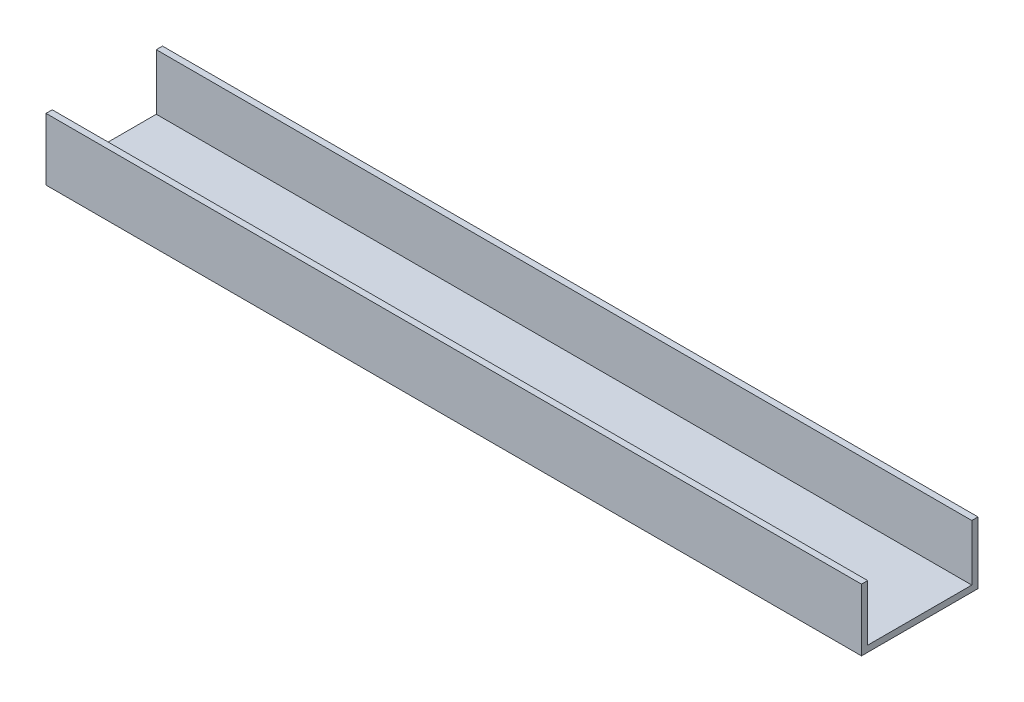
ISO-10303-21;
HEADER;
FILE_DESCRIPTION(('STEP AP214'),'2;1');
FILE_NAME('part.step','',(''),(''),'','','');
FILE_SCHEMA(('AUTOMOTIVE_DESIGN { 1 0 10303 214 1 1 1 1 }'));
ENDSEC;
DATA;
#1=APPLICATION_CONTEXT('core data for automotive mechanical design processes');
#2=APPLICATION_PROTOCOL_DEFINITION('international standard','automotive_design',2000,#1);
#3=PRODUCT_CONTEXT('',#1,'mechanical');
#4=PRODUCT('Part','Part','',(#3));
#5=PRODUCT_RELATED_PRODUCT_CATEGORY('part','',(#4));
#6=PRODUCT_DEFINITION_FORMATION('','',#4);
#7=PRODUCT_DEFINITION_CONTEXT('part definition',#1,'design');
#8=PRODUCT_DEFINITION('design','',#6,#7);
#9=PRODUCT_DEFINITION_SHAPE('','',#8);
#10=(LENGTH_UNIT() NAMED_UNIT(*) SI_UNIT(.MILLI.,.METRE.));
#11=(NAMED_UNIT(*) PLANE_ANGLE_UNIT() SI_UNIT($,.RADIAN.));
#12=(NAMED_UNIT(*) SI_UNIT($,.STERADIAN.) SOLID_ANGLE_UNIT());
#13=UNCERTAINTY_MEASURE_WITH_UNIT(LENGTH_MEASURE(1.E-05),#10,'distance_accuracy_value','');
#14=(GEOMETRIC_REPRESENTATION_CONTEXT(3) GLOBAL_UNCERTAINTY_ASSIGNED_CONTEXT((#13)) GLOBAL_UNIT_ASSIGNED_CONTEXT((#10,
#11,#12)) REPRESENTATION_CONTEXT('',''));
#15=CARTESIAN_POINT('',(0.,0.,0.));
#16=DIRECTION('',(0.,0.,1.));
#17=DIRECTION('',(1.,0.,0.));
#18=AXIS2_PLACEMENT_3D('',#15,#16,#17);
#19=CARTESIAN_POINT('',(0.,4.,0.));
#20=DIRECTION('',(0.,-1.,0.));
#21=DIRECTION('',(0.,0.,-1.));
#22=AXIS2_PLACEMENT_3D('',#19,#20,#21);
#23=PLANE('',#22);
#24=DIRECTION('',(-1.,0.,0.));
#25=VECTOR('',#24,1.);
#26=CARTESIAN_POINT('',(525.,4.,-4.));
#27=LINE('',#26,#25);
#28=CARTESIAN_POINT('',(525.,4.,-4.));
#29=VERTEX_POINT('',#28);
#30=CARTESIAN_POINT('',(0.,4.,-4.));
#31=VERTEX_POINT('',#30);
#32=EDGE_CURVE('E121',#29,#31,#27,.T.);
#33=ORIENTED_EDGE('',*,*,#32,.F.);
#34=DIRECTION('',(0.,0.,-1.));
#35=VECTOR('',#34,1.);
#36=CARTESIAN_POINT('',(525.,4.,0.));
#37=LINE('',#36,#35);
#38=CARTESIAN_POINT('',(525.,4.,-71.));
#39=VERTEX_POINT('',#38);
#40=EDGE_CURVE('E110',#29,#39,#37,.T.);
#41=ORIENTED_EDGE('',*,*,#40,.T.);
#42=DIRECTION('',(1.,0.,0.));
#43=VECTOR('',#42,1.);
#44=CARTESIAN_POINT('',(0.,4.,-71.));
#45=LINE('',#44,#43);
#46=CARTESIAN_POINT('',(0.,4.,-71.));
#47=VERTEX_POINT('',#46);
#48=EDGE_CURVE('E66',#47,#39,#45,.T.);
#49=ORIENTED_EDGE('',*,*,#48,.F.);
#50=DIRECTION('',(0.,0.,1.));
#51=VECTOR('',#50,1.);
#52=CARTESIAN_POINT('',(0.,4.,0.));
#53=LINE('',#52,#51);
#54=EDGE_CURVE('E61',#47,#31,#53,.T.);
#55=ORIENTED_EDGE('',*,*,#54,.T.);
#56=EDGE_LOOP('',(#33,#41,#49,#55));
#57=FACE_BOUND('',#56,.T.);
#58=ADVANCED_FACE('F45',(#57),#23,.F.);
#59=CARTESIAN_POINT('',(0.,4.,0.));
#60=DIRECTION('',(1.,0.,0.));
#61=DIRECTION('',(0.,0.,-1.));
#62=AXIS2_PLACEMENT_3D('',#59,#60,#61);
#63=PLANE('',#62);
#64=DIRECTION('',(0.,0.,1.));
#65=VECTOR('',#64,1.);
#66=CARTESIAN_POINT('',(0.,0.,0.));
#67=LINE('',#66,#65);
#68=CARTESIAN_POINT('',(0.,0.,-75.));
#69=VERTEX_POINT('',#68);
#70=CARTESIAN_POINT('',(0.,0.,0.));
#71=VERTEX_POINT('',#70);
#72=EDGE_CURVE('E172',#69,#71,#67,.T.);
#73=ORIENTED_EDGE('',*,*,#72,.T.);
#74=DIRECTION('',(0.,-1.,0.));
#75=VECTOR('',#74,1.);
#76=CARTESIAN_POINT('',(0.,4.,0.));
#77=LINE('',#76,#75);
#78=CARTESIAN_POINT('',(0.,40.,0.));
#79=VERTEX_POINT('',#78);
#80=EDGE_CURVE('E11',#79,#71,#77,.T.);
#81=ORIENTED_EDGE('',*,*,#80,.F.);
#82=DIRECTION('',(0.,0.,1.));
#83=VECTOR('',#82,1.);
#84=CARTESIAN_POINT('',(0.,40.,0.));
#85=LINE('',#84,#83);
#86=CARTESIAN_POINT('',(0.,40.,-3.99999999999993));
#87=VERTEX_POINT('',#86);
#88=EDGE_CURVE('E141',#87,#79,#85,.T.);
#89=ORIENTED_EDGE('',*,*,#88,.F.);
#90=DIRECTION('',(0.,-1.,0.));
#91=VECTOR('',#90,1.);
#92=CARTESIAN_POINT('',(0.,40.,-3.99999999999993));
#93=LINE('',#92,#91);
#94=EDGE_CURVE('E132',#87,#31,#93,.T.);
#95=ORIENTED_EDGE('',*,*,#94,.T.);
#96=ORIENTED_EDGE('',*,*,#54,.F.);
#97=DIRECTION('',(0.,-1.,0.));
#98=VECTOR('',#97,1.);
#99=CARTESIAN_POINT('',(0.,40.,-71.));
#100=LINE('',#99,#98);
#101=CARTESIAN_POINT('',(0.,40.,-71.));
#102=VERTEX_POINT('',#101);
#103=EDGE_CURVE('E168',#102,#47,#100,.T.);
#104=ORIENTED_EDGE('',*,*,#103,.F.);
#105=DIRECTION('',(0.,0.,1.));
#106=VECTOR('',#105,1.);
#107=CARTESIAN_POINT('',(0.,40.,-75.));
#108=LINE('',#107,#106);
#109=CARTESIAN_POINT('',(0.,40.,-75.));
#110=VERTEX_POINT('',#109);
#111=EDGE_CURVE('E149',#110,#102,#108,.T.);
#112=ORIENTED_EDGE('',*,*,#111,.F.);
#113=DIRECTION('',(0.,-1.,0.));
#114=VECTOR('',#113,1.);
#115=CARTESIAN_POINT('',(0.,4.,-75.));
#116=LINE('',#115,#114);
#117=EDGE_CURVE('E119',#110,#69,#116,.T.);
#118=ORIENTED_EDGE('',*,*,#117,.T.);
#119=EDGE_LOOP('',(#73,#81,#89,#95,#96,#104,#112,#118));
#120=FACE_BOUND('',#119,.T.);
#121=ADVANCED_FACE('F47',(#120),#63,.F.);
#122=CARTESIAN_POINT('',(0.,4.,0.));
#123=DIRECTION('',(0.,0.,-1.));
#124=DIRECTION('',(-1.,0.,0.));
#125=AXIS2_PLACEMENT_3D('',#122,#123,#124);
#126=PLANE('',#125);
#127=DIRECTION('',(1.,0.,0.));
#128=VECTOR('',#127,1.);
#129=CARTESIAN_POINT('',(0.,0.,0.));
#130=LINE('',#129,#128);
#131=CARTESIAN_POINT('',(525.,0.,0.));
#132=VERTEX_POINT('',#131);
#133=EDGE_CURVE('E179',#71,#132,#130,.T.);
#134=ORIENTED_EDGE('',*,*,#133,.T.);
#135=DIRECTION('',(0.,-1.,0.));
#136=VECTOR('',#135,1.);
#137=CARTESIAN_POINT('',(525.,4.,0.));
#138=LINE('',#137,#136);
#139=CARTESIAN_POINT('',(525.,40.,0.));
#140=VERTEX_POINT('',#139);
#141=EDGE_CURVE('E54',#140,#132,#138,.T.);
#142=ORIENTED_EDGE('',*,*,#141,.F.);
#143=DIRECTION('',(1.,0.,0.));
#144=VECTOR('',#143,1.);
#145=CARTESIAN_POINT('',(525.,40.,0.));
#146=LINE('',#145,#144);
#147=EDGE_CURVE('E135',#79,#140,#146,.T.);
#148=ORIENTED_EDGE('',*,*,#147,.F.);
#149=ORIENTED_EDGE('',*,*,#80,.T.);
#150=EDGE_LOOP('',(#134,#142,#148,#149));
#151=FACE_BOUND('',#150,.T.);
#152=ADVANCED_FACE('F226',(#151),#126,.F.);
#153=CARTESIAN_POINT('',(525.,4.,0.));
#154=DIRECTION('',(-1.,0.,0.));
#155=DIRECTION('',(0.,0.,1.));
#156=AXIS2_PLACEMENT_3D('',#153,#154,#155);
#157=PLANE('',#156);
#158=DIRECTION('',(0.,0.,-1.));
#159=VECTOR('',#158,1.);
#160=CARTESIAN_POINT('',(525.,0.,0.));
#161=LINE('',#160,#159);
#162=CARTESIAN_POINT('',(525.,0.,-75.));
#163=VERTEX_POINT('',#162);
#164=EDGE_CURVE('E182',#132,#163,#161,.T.);
#165=ORIENTED_EDGE('',*,*,#164,.T.);
#166=DIRECTION('',(0.,-1.,0.));
#167=VECTOR('',#166,1.);
#168=CARTESIAN_POINT('',(525.,4.,-75.));
#169=LINE('',#168,#167);
#170=CARTESIAN_POINT('',(525.,40.,-75.));
#171=VERTEX_POINT('',#170);
#172=EDGE_CURVE('E190',#171,#163,#169,.T.);
#173=ORIENTED_EDGE('',*,*,#172,.F.);
#174=DIRECTION('',(0.,0.,-1.));
#175=VECTOR('',#174,1.);
#176=CARTESIAN_POINT('',(525.,40.,-75.));
#177=LINE('',#176,#175);
#178=CARTESIAN_POINT('',(525.,40.,-71.));
#179=VERTEX_POINT('',#178);
#180=EDGE_CURVE('E156',#179,#171,#177,.T.);
#181=ORIENTED_EDGE('',*,*,#180,.F.);
#182=DIRECTION('',(0.,-1.,0.));
#183=VECTOR('',#182,1.);
#184=CARTESIAN_POINT('',(525.,40.,-71.));
#185=LINE('',#184,#183);
#186=EDGE_CURVE('E117',#179,#39,#185,.T.);
#187=ORIENTED_EDGE('',*,*,#186,.T.);
#188=ORIENTED_EDGE('',*,*,#40,.F.);
#189=DIRECTION('',(0.,-1.,0.));
#190=VECTOR('',#189,1.);
#191=CARTESIAN_POINT('',(525.,40.,-4.));
#192=LINE('',#191,#190);
#193=CARTESIAN_POINT('',(525.,40.,-4.));
#194=VERTEX_POINT('',#193);
#195=EDGE_CURVE('E114',#194,#29,#192,.T.);
#196=ORIENTED_EDGE('',*,*,#195,.F.);
#197=DIRECTION('',(0.,0.,-1.));
#198=VECTOR('',#197,1.);
#199=CARTESIAN_POINT('',(525.,40.,0.));
#200=LINE('',#199,#198);
#201=EDGE_CURVE('E126',#140,#194,#200,.T.);
#202=ORIENTED_EDGE('',*,*,#201,.F.);
#203=ORIENTED_EDGE('',*,*,#141,.T.);
#204=EDGE_LOOP('',(#165,#173,#181,#187,#188,#196,#202,#203));
#205=FACE_BOUND('',#204,.T.);
#206=ADVANCED_FACE('F111',(#205),#157,.F.);
#207=CARTESIAN_POINT('',(0.,4.,-75.));
#208=DIRECTION('',(0.,0.,1.));
#209=DIRECTION('',(1.,0.,0.));
#210=AXIS2_PLACEMENT_3D('',#207,#208,#209);
#211=PLANE('',#210);
#212=DIRECTION('',(-1.,0.,0.));
#213=VECTOR('',#212,1.);
#214=CARTESIAN_POINT('',(0.,0.,-75.));
#215=LINE('',#214,#213);
#216=EDGE_CURVE('E174',#163,#69,#215,.T.);
#217=ORIENTED_EDGE('',*,*,#216,.T.);
#218=ORIENTED_EDGE('',*,*,#117,.F.);
#219=DIRECTION('',(-1.,0.,0.));
#220=VECTOR('',#219,1.);
#221=CARTESIAN_POINT('',(0.,40.,-75.));
#222=LINE('',#221,#220);
#223=EDGE_CURVE('E160',#171,#110,#222,.T.);
#224=ORIENTED_EDGE('',*,*,#223,.F.);
#225=ORIENTED_EDGE('',*,*,#172,.T.);
#226=EDGE_LOOP('',(#217,#218,#224,#225));
#227=FACE_BOUND('',#226,.T.);
#228=ADVANCED_FACE('F203',(#227),#211,.F.);
#229=CARTESIAN_POINT('',(0.,0.,0.));
#230=DIRECTION('',(0.,-1.,0.));
#231=DIRECTION('',(0.,0.,-1.));
#232=AXIS2_PLACEMENT_3D('',#229,#230,#231);
#233=PLANE('',#232);
#234=ORIENTED_EDGE('',*,*,#72,.F.);
#235=ORIENTED_EDGE('',*,*,#216,.F.);
#236=ORIENTED_EDGE('',*,*,#164,.F.);
#237=ORIENTED_EDGE('',*,*,#133,.F.);
#238=EDGE_LOOP('',(#234,#235,#236,#237));
#239=FACE_BOUND('',#238,.T.);
#240=ADVANCED_FACE('F201',(#239),#233,.T.);
#241=CARTESIAN_POINT('',(0.,40.,-71.));
#242=DIRECTION('',(0.,0.,-1.));
#243=DIRECTION('',(-1.,0.,0.));
#244=AXIS2_PLACEMENT_3D('',#241,#242,#243);
#245=PLANE('',#244);
#246=ORIENTED_EDGE('',*,*,#48,.T.);
#247=ORIENTED_EDGE('',*,*,#186,.F.);
#248=DIRECTION('',(1.,0.,0.));
#249=VECTOR('',#248,1.);
#250=CARTESIAN_POINT('',(0.,40.,-71.));
#251=LINE('',#250,#249);
#252=EDGE_CURVE('E153',#102,#179,#251,.T.);
#253=ORIENTED_EDGE('',*,*,#252,.F.);
#254=ORIENTED_EDGE('',*,*,#103,.T.);
#255=EDGE_LOOP('',(#246,#247,#253,#254));
#256=FACE_BOUND('',#255,.T.);
#257=ADVANCED_FACE('F211',(#256),#245,.F.);
#258=CARTESIAN_POINT('',(0.,40.,0.));
#259=DIRECTION('',(0.,1.,0.));
#260=DIRECTION('',(0.,0.,1.));
#261=AXIS2_PLACEMENT_3D('',#258,#259,#260);
#262=PLANE('',#261);
#263=ORIENTED_EDGE('',*,*,#111,.T.);
#264=ORIENTED_EDGE('',*,*,#252,.T.);
#265=ORIENTED_EDGE('',*,*,#180,.T.);
#266=ORIENTED_EDGE('',*,*,#223,.T.);
#267=EDGE_LOOP('',(#263,#264,#265,#266));
#268=FACE_BOUND('',#267,.T.);
#269=ADVANCED_FACE('F209',(#268),#262,.T.);
#270=CARTESIAN_POINT('',(525.,40.,-4.));
#271=DIRECTION('',(0.,0.,1.));
#272=DIRECTION('',(1.,0.,0.));
#273=AXIS2_PLACEMENT_3D('',#270,#271,#272);
#274=PLANE('',#273);
#275=ORIENTED_EDGE('',*,*,#32,.T.);
#276=ORIENTED_EDGE('',*,*,#94,.F.);
#277=DIRECTION('',(-1.,0.,0.));
#278=VECTOR('',#277,1.);
#279=CARTESIAN_POINT('',(525.,40.,-4.));
#280=LINE('',#279,#278);
#281=EDGE_CURVE('E129',#194,#87,#280,.T.);
#282=ORIENTED_EDGE('',*,*,#281,.F.);
#283=ORIENTED_EDGE('',*,*,#195,.T.);
#284=EDGE_LOOP('',(#275,#276,#282,#283));
#285=FACE_BOUND('',#284,.T.);
#286=ADVANCED_FACE('F128',(#285),#274,.F.);
#287=CARTESIAN_POINT('',(0.,40.,0.));
#288=DIRECTION('',(0.,1.,0.));
#289=DIRECTION('',(0.,0.,1.));
#290=AXIS2_PLACEMENT_3D('',#287,#288,#289);
#291=PLANE('',#290);
#292=ORIENTED_EDGE('',*,*,#201,.T.);
#293=ORIENTED_EDGE('',*,*,#281,.T.);
#294=ORIENTED_EDGE('',*,*,#88,.T.);
#295=ORIENTED_EDGE('',*,*,#147,.T.);
#296=EDGE_LOOP('',(#292,#293,#294,#295));
#297=FACE_BOUND('',#296,.T.);
#298=ADVANCED_FACE('F235',(#297),#291,.T.);
#299=CLOSED_SHELL('',(#58,#121,#152,#206,#228,#240,#257,#269,#286,#298));
#300=MANIFOLD_SOLID_BREP('B2',#299);
#301=ADVANCED_BREP_SHAPE_REPRESENTATION('',(#18,#300),#14);
#302=SHAPE_DEFINITION_REPRESENTATION(#9,#301);
ENDSEC;
END-ISO-10303-21;
